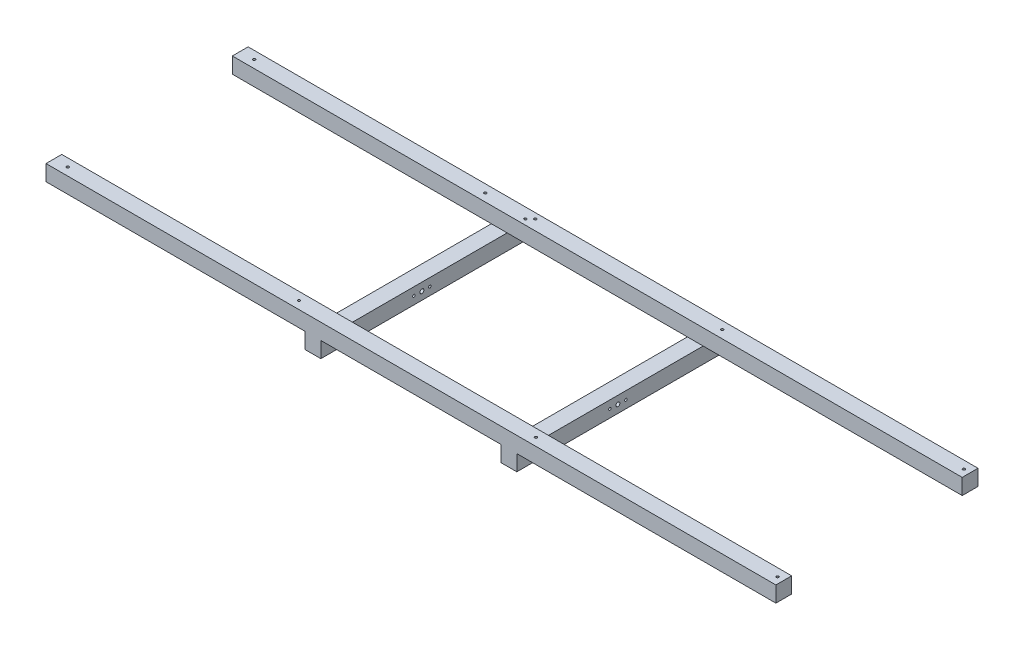
ISO-10303-21;
HEADER;
FILE_DESCRIPTION(('STEP AP214'),'2;1');
FILE_NAME('part.step','',(''),(''),'','','');
FILE_SCHEMA(('AUTOMOTIVE_DESIGN { 1 0 10303 214 1 1 1 1 }'));
ENDSEC;
DATA;
#1=APPLICATION_CONTEXT('core data for automotive mechanical design processes');
#2=APPLICATION_PROTOCOL_DEFINITION('international standard','automotive_design',2000,#1);
#3=PRODUCT_CONTEXT('',#1,'mechanical');
#4=PRODUCT('Part','Part','',(#3));
#5=PRODUCT_RELATED_PRODUCT_CATEGORY('part','',(#4));
#6=PRODUCT_DEFINITION_FORMATION('','',#4);
#7=PRODUCT_DEFINITION_CONTEXT('part definition',#1,'design');
#8=PRODUCT_DEFINITION('design','',#6,#7);
#9=PRODUCT_DEFINITION_SHAPE('','',#8);
#10=(LENGTH_UNIT() NAMED_UNIT(*) SI_UNIT(.MILLI.,.METRE.));
#11=(NAMED_UNIT(*) PLANE_ANGLE_UNIT() SI_UNIT($,.RADIAN.));
#12=(NAMED_UNIT(*) SI_UNIT($,.STERADIAN.) SOLID_ANGLE_UNIT());
#13=UNCERTAINTY_MEASURE_WITH_UNIT(LENGTH_MEASURE(1.E-05),#10,'distance_accuracy_value','');
#14=(GEOMETRIC_REPRESENTATION_CONTEXT(3) GLOBAL_UNCERTAINTY_ASSIGNED_CONTEXT((#13)) GLOBAL_UNIT_ASSIGNED_CONTEXT((#10,
#11,#12)) REPRESENTATION_CONTEXT('',''));
#15=CARTESIAN_POINT('',(0.,0.,0.));
#16=DIRECTION('',(0.,0.,1.));
#17=DIRECTION('',(1.,0.,0.));
#18=AXIS2_PLACEMENT_3D('',#15,#16,#17);
#19=CARTESIAN_POINT('',(0.,0.,0.));
#20=DIRECTION('',(0.,1.,0.));
#21=DIRECTION('',(0.,0.,1.));
#22=AXIS2_PLACEMENT_3D('',#19,#20,#21);
#23=PLANE('',#22);
#24=DIRECTION('',(0.,0.,1.));
#25=VECTOR('',#24,1.);
#26=CARTESIAN_POINT('',(-212.55,0.,-202.85));
#27=LINE('',#26,#25);
#28=CARTESIAN_POINT('',(-212.55,0.,-171.15));
#29=VERTEX_POINT('',#28);
#30=CARTESIAN_POINT('',(-212.55,0.,171.15));
#31=VERTEX_POINT('',#30);
#32=EDGE_CURVE('E275',#29,#31,#27,.T.);
#33=ORIENTED_EDGE('',*,*,#32,.T.);
#34=DIRECTION('',(-1.,0.,0.));
#35=VECTOR('',#34,1.);
#36=CARTESIAN_POINT('',(-732.55,0.,171.15));
#37=LINE('',#36,#35);
#38=CARTESIAN_POINT('',(-180.85,0.,171.15));
#39=VERTEX_POINT('',#38);
#40=EDGE_CURVE('E448',#39,#31,#37,.T.);
#41=ORIENTED_EDGE('',*,*,#40,.F.);
#42=DIRECTION('',(0.,0.,-1.));
#43=VECTOR('',#42,1.);
#44=CARTESIAN_POINT('',(-180.85,0.,-202.85));
#45=LINE('',#44,#43);
#46=CARTESIAN_POINT('',(-180.85,0.,-171.15));
#47=VERTEX_POINT('',#46);
#48=EDGE_CURVE('E295',#39,#47,#45,.T.);
#49=ORIENTED_EDGE('',*,*,#48,.T.);
#50=DIRECTION('',(1.,0.,0.));
#51=VECTOR('',#50,1.);
#52=CARTESIAN_POINT('',(-732.55,0.,-171.15));
#53=LINE('',#52,#51);
#54=EDGE_CURVE('E11',#29,#47,#53,.T.);
#55=ORIENTED_EDGE('',*,*,#54,.F.);
#56=EDGE_LOOP('',(#33,#41,#49,#55));
#57=FACE_BOUND('',#56,.T.);
#58=ADVANCED_FACE('F33',(#57),#23,.T.);
#59=CARTESIAN_POINT('',(0.,0.,0.));
#60=DIRECTION('',(0.,1.,0.));
#61=DIRECTION('',(0.,0.,1.));
#62=AXIS2_PLACEMENT_3D('',#59,#60,#61);
#63=PLANE('',#62);
#64=DIRECTION('',(0.,0.,1.));
#65=VECTOR('',#64,1.);
#66=CARTESIAN_POINT('',(180.85,0.,-202.85));
#67=LINE('',#66,#65);
#68=CARTESIAN_POINT('',(180.85,0.,-171.15));
#69=VERTEX_POINT('',#68);
#70=CARTESIAN_POINT('',(180.85,0.,171.15));
#71=VERTEX_POINT('',#70);
#72=EDGE_CURVE('E212',#69,#71,#67,.T.);
#73=ORIENTED_EDGE('',*,*,#72,.T.);
#74=CARTESIAN_POINT('',(212.55,0.,171.15));
#75=VERTEX_POINT('',#74);
#76=EDGE_CURVE('E412',#75,#71,#37,.T.);
#77=ORIENTED_EDGE('',*,*,#76,.F.);
#78=DIRECTION('',(0.,0.,-1.));
#79=VECTOR('',#78,1.);
#80=CARTESIAN_POINT('',(212.55,0.,-202.85));
#81=LINE('',#80,#79);
#82=CARTESIAN_POINT('',(212.55,0.,-171.15));
#83=VERTEX_POINT('',#82);
#84=EDGE_CURVE('E233',#75,#83,#81,.T.);
#85=ORIENTED_EDGE('',*,*,#84,.T.);
#86=EDGE_CURVE('E447',#69,#83,#53,.T.);
#87=ORIENTED_EDGE('',*,*,#86,.F.);
#88=EDGE_LOOP('',(#73,#77,#85,#87));
#89=FACE_BOUND('',#88,.T.);
#90=ADVANCED_FACE('F446',(#89),#63,.T.);
#91=CARTESIAN_POINT('',(0.,0.,0.));
#92=DIRECTION('',(0.,1.,0.));
#93=DIRECTION('',(0.,0.,1.));
#94=AXIS2_PLACEMENT_3D('',#91,#92,#93);
#95=PLANE('',#94);
#96=CARTESIAN_POINT('',(-155.,0.,-182.));
#97=DIRECTION('',(0.,1.,0.));
#98=DIRECTION('',(0.,0.,1.));
#99=AXIS2_PLACEMENT_3D('',#96,#97,#98);
#100=CIRCLE('',#99,2.5);
#101=CARTESIAN_POINT('',(-155.,0.,-179.5));
#102=VERTEX_POINT('',#101);
#103=EDGE_CURVE('E343',#102,#102,#100,.T.);
#104=ORIENTED_EDGE('',*,*,#103,.T.);
#105=EDGE_LOOP('',(#104));
#106=FACE_BOUND('',#105,.T.);
#107=CARTESIAN_POINT('',(-145.,0.,-192.));
#108=DIRECTION('',(0.,1.,0.));
#109=DIRECTION('',(0.,0.,1.));
#110=AXIS2_PLACEMENT_3D('',#107,#108,#109);
#111=CIRCLE('',#110,2.5);
#112=CARTESIAN_POINT('',(-145.,0.,-189.5));
#113=VERTEX_POINT('',#112);
#114=EDGE_CURVE('E339',#113,#113,#111,.T.);
#115=ORIENTED_EDGE('',*,*,#114,.T.);
#116=EDGE_LOOP('',(#115));
#117=FACE_BOUND('',#116,.T.);
#118=DIRECTION('',(-1.,0.,0.));
#119=VECTOR('',#118,1.);
#120=CARTESIAN_POINT('',(-732.55,0.,-202.85));
#121=LINE('',#120,#119);
#122=CARTESIAN_POINT('',(180.85,0.,-202.85));
#123=VERTEX_POINT('',#122);
#124=CARTESIAN_POINT('',(-180.85,0.,-202.85));
#125=VERTEX_POINT('',#124);
#126=EDGE_CURVE('E263',#123,#125,#121,.T.);
#127=ORIENTED_EDGE('',*,*,#126,.F.);
#128=EDGE_CURVE('E227',#123,#69,#67,.T.);
#129=ORIENTED_EDGE('',*,*,#128,.T.);
#130=EDGE_CURVE('E45',#47,#69,#53,.T.);
#131=ORIENTED_EDGE('',*,*,#130,.F.);
#132=EDGE_CURVE('E293',#47,#125,#45,.T.);
#133=ORIENTED_EDGE('',*,*,#132,.T.);
#134=EDGE_LOOP('',(#127,#129,#131,#133));
#135=FACE_BOUND('',#134,.T.);
#136=ADVANCED_FACE('F494',(#106,#117,#135),#95,.F.);
#137=CARTESIAN_POINT('',(-212.55,-31.7,-202.85));
#138=DIRECTION('',(-1.,0.,0.));
#139=DIRECTION('',(0.,0.,1.));
#140=AXIS2_PLACEMENT_3D('',#137,#138,#139);
#141=PLANE('',#140);
#142=CARTESIAN_POINT('',(-212.55,-15.85,-16.));
#143=DIRECTION('',(-1.,0.,0.));
#144=DIRECTION('',(0.,0.,1.));
#145=AXIS2_PLACEMENT_3D('',#142,#143,#144);
#146=CIRCLE('',#145,2.5);
#147=CARTESIAN_POINT('',(-212.55,-15.85,-13.5));
#148=VERTEX_POINT('',#147);
#149=EDGE_CURVE('E336',#148,#148,#146,.T.);
#150=ORIENTED_EDGE('',*,*,#149,.F.);
#151=EDGE_LOOP('',(#150));
#152=FACE_BOUND('',#151,.T.);
#153=CARTESIAN_POINT('',(-212.55,-15.85,16.));
#154=DIRECTION('',(-1.,0.,0.));
#155=DIRECTION('',(0.,0.,1.));
#156=AXIS2_PLACEMENT_3D('',#153,#154,#155);
#157=CIRCLE('',#156,2.5);
#158=CARTESIAN_POINT('',(-212.55,-15.85,18.5));
#159=VERTEX_POINT('',#158);
#160=EDGE_CURVE('E327',#159,#159,#157,.T.);
#161=ORIENTED_EDGE('',*,*,#160,.F.);
#162=EDGE_LOOP('',(#161));
#163=FACE_BOUND('',#162,.T.);
#164=CARTESIAN_POINT('',(-212.55,-15.85,0.));
#165=DIRECTION('',(-1.,0.,0.));
#166=DIRECTION('',(0.,0.,1.));
#167=AXIS2_PLACEMENT_3D('',#164,#165,#166);
#168=CIRCLE('',#167,4.);
#169=CARTESIAN_POINT('',(-212.55,-15.85,4.));
#170=VERTEX_POINT('',#169);
#171=EDGE_CURVE('E310',#170,#170,#168,.T.);
#172=ORIENTED_EDGE('',*,*,#171,.F.);
#173=EDGE_LOOP('',(#172));
#174=FACE_BOUND('',#173,.T.);
#175=CARTESIAN_POINT('',(-212.55,0.,-202.85));
#176=VERTEX_POINT('',#175);
#177=EDGE_CURVE('E290',#176,#29,#27,.T.);
#178=ORIENTED_EDGE('',*,*,#177,.F.);
#179=DIRECTION('',(0.,1.,0.));
#180=VECTOR('',#179,1.);
#181=CARTESIAN_POINT('',(-212.55,-31.7,-202.85));
#182=LINE('',#181,#180);
#183=CARTESIAN_POINT('',(-212.55,-31.7,-202.85));
#184=VERTEX_POINT('',#183);
#185=EDGE_CURVE('E42',#184,#176,#182,.T.);
#186=ORIENTED_EDGE('',*,*,#185,.F.);
#187=DIRECTION('',(0.,0.,1.));
#188=VECTOR('',#187,1.);
#189=CARTESIAN_POINT('',(-212.55,-31.7,-202.85));
#190=LINE('',#189,#188);
#191=CARTESIAN_POINT('',(-212.55,-31.7,202.85));
#192=VERTEX_POINT('',#191);
#193=EDGE_CURVE('E276',#184,#192,#190,.T.);
#194=ORIENTED_EDGE('',*,*,#193,.T.);
#195=DIRECTION('',(0.,1.,0.));
#196=VECTOR('',#195,1.);
#197=CARTESIAN_POINT('',(-212.55,-31.7,202.85));
#198=LINE('',#197,#196);
#199=CARTESIAN_POINT('',(-212.55,0.,202.85));
#200=VERTEX_POINT('',#199);
#201=EDGE_CURVE('E289',#192,#200,#198,.T.);
#202=ORIENTED_EDGE('',*,*,#201,.T.);
#203=DIRECTION('',(0.,0.,1.));
#204=VECTOR('',#203,1.);
#205=CARTESIAN_POINT('',(-212.55,0.,-202.85));
#206=LINE('',#205,#204);
#207=EDGE_CURVE('E205',#31,#200,#206,.T.);
#208=ORIENTED_EDGE('',*,*,#207,.F.);
#209=ORIENTED_EDGE('',*,*,#32,.F.);
#210=EDGE_LOOP('',(#178,#186,#194,#202,#208,#209));
#211=FACE_BOUND('',#210,.T.);
#212=ADVANCED_FACE('F35',(#152,#163,#174,#211),#141,.T.);
#213=CARTESIAN_POINT('',(-212.55,-31.7,-202.85));
#214=DIRECTION('',(0.,0.,-1.));
#215=DIRECTION('',(-1.,0.,0.));
#216=AXIS2_PLACEMENT_3D('',#213,#214,#215);
#217=PLANE('',#216);
#218=ORIENTED_EDGE('',*,*,#185,.T.);
#219=CARTESIAN_POINT('',(-732.55,0.,-202.85));
#220=VERTEX_POINT('',#219);
#221=EDGE_CURVE('E260',#176,#220,#121,.T.);
#222=ORIENTED_EDGE('',*,*,#221,.T.);
#223=DIRECTION('',(0.,-1.,0.));
#224=VECTOR('',#223,1.);
#225=CARTESIAN_POINT('',(-732.55,31.7,-202.85));
#226=LINE('',#225,#224);
#227=CARTESIAN_POINT('',(-732.55,31.7,-202.85));
#228=VERTEX_POINT('',#227);
#229=EDGE_CURVE('E253',#228,#220,#226,.T.);
#230=ORIENTED_EDGE('',*,*,#229,.F.);
#231=DIRECTION('',(-1.,0.,0.));
#232=VECTOR('',#231,1.);
#233=CARTESIAN_POINT('',(-732.55,31.7,-202.85));
#234=LINE('',#233,#232);
#235=CARTESIAN_POINT('',(732.55,31.7,-202.85));
#236=VERTEX_POINT('',#235);
#237=EDGE_CURVE('E251',#236,#228,#234,.T.);
#238=ORIENTED_EDGE('',*,*,#237,.F.);
#239=DIRECTION('',(0.,-1.,0.));
#240=VECTOR('',#239,1.);
#241=CARTESIAN_POINT('',(732.55,31.7,-202.85));
#242=LINE('',#241,#240);
#243=CARTESIAN_POINT('',(732.55,0.,-202.85));
#244=VERTEX_POINT('',#243);
#245=EDGE_CURVE('E266',#236,#244,#242,.T.);
#246=ORIENTED_EDGE('',*,*,#245,.T.);
#247=CARTESIAN_POINT('',(212.55,0.,-202.85));
#248=VERTEX_POINT('',#247);
#249=EDGE_CURVE('E247',#244,#248,#121,.T.);
#250=ORIENTED_EDGE('',*,*,#249,.T.);
#251=DIRECTION('',(0.,1.,0.));
#252=VECTOR('',#251,1.);
#253=CARTESIAN_POINT('',(212.55,-31.7,-202.85));
#254=LINE('',#253,#252);
#255=CARTESIAN_POINT('',(212.55,-31.7,-202.85));
#256=VERTEX_POINT('',#255);
#257=EDGE_CURVE('E237',#256,#248,#254,.T.);
#258=ORIENTED_EDGE('',*,*,#257,.F.);
#259=DIRECTION('',(-1.,0.,0.));
#260=VECTOR('',#259,1.);
#261=CARTESIAN_POINT('',(180.85,-31.7,-202.85));
#262=LINE('',#261,#260);
#263=CARTESIAN_POINT('',(180.85,-31.7,-202.85));
#264=VERTEX_POINT('',#263);
#265=EDGE_CURVE('E223',#256,#264,#262,.T.);
#266=ORIENTED_EDGE('',*,*,#265,.T.);
#267=DIRECTION('',(0.,1.,0.));
#268=VECTOR('',#267,1.);
#269=CARTESIAN_POINT('',(180.85,-31.7,-202.85));
#270=LINE('',#269,#268);
#271=EDGE_CURVE('E234',#264,#123,#270,.T.);
#272=ORIENTED_EDGE('',*,*,#271,.T.);
#273=ORIENTED_EDGE('',*,*,#126,.T.);
#274=DIRECTION('',(0.,1.,0.));
#275=VECTOR('',#274,1.);
#276=CARTESIAN_POINT('',(-180.85,-31.7,-202.85));
#277=LINE('',#276,#275);
#278=CARTESIAN_POINT('',(-180.85,-31.7,-202.85));
#279=VERTEX_POINT('',#278);
#280=EDGE_CURVE('E297',#279,#125,#277,.T.);
#281=ORIENTED_EDGE('',*,*,#280,.F.);
#282=DIRECTION('',(-1.,0.,0.));
#283=VECTOR('',#282,1.);
#284=CARTESIAN_POINT('',(-212.55,-31.7,-202.85));
#285=LINE('',#284,#283);
#286=EDGE_CURVE('E286',#279,#184,#285,.T.);
#287=ORIENTED_EDGE('',*,*,#286,.T.);
#288=EDGE_LOOP('',(#218,#222,#230,#238,#246,#250,#258,#266,#272,#273,#281,#287));
#289=FACE_BOUND('',#288,.T.);
#290=ADVANCED_FACE('F437',(#289),#217,.T.);
#291=CARTESIAN_POINT('',(-180.85,-31.7,-202.85));
#292=DIRECTION('',(1.,0.,0.));
#293=DIRECTION('',(0.,0.,-1.));
#294=AXIS2_PLACEMENT_3D('',#291,#292,#293);
#295=PLANE('',#294);
#296=CARTESIAN_POINT('',(-180.85,-15.85,-16.));
#297=DIRECTION('',(1.,0.,0.));
#298=DIRECTION('',(0.,0.,-1.));
#299=AXIS2_PLACEMENT_3D('',#296,#297,#298);
#300=CIRCLE('',#299,2.5);
#301=CARTESIAN_POINT('',(-180.85,-15.85,-18.5));
#302=VERTEX_POINT('',#301);
#303=EDGE_CURVE('E333',#302,#302,#300,.T.);
#304=ORIENTED_EDGE('',*,*,#303,.F.);
#305=EDGE_LOOP('',(#304));
#306=FACE_BOUND('',#305,.T.);
#307=CARTESIAN_POINT('',(-180.85,-15.85,16.));
#308=DIRECTION('',(1.,0.,0.));
#309=DIRECTION('',(0.,0.,-1.));
#310=AXIS2_PLACEMENT_3D('',#307,#308,#309);
#311=CIRCLE('',#310,2.5);
#312=CARTESIAN_POINT('',(-180.85,-15.85,13.5));
#313=VERTEX_POINT('',#312);
#314=EDGE_CURVE('E314',#313,#313,#311,.T.);
#315=ORIENTED_EDGE('',*,*,#314,.F.);
#316=EDGE_LOOP('',(#315));
#317=FACE_BOUND('',#316,.T.);
#318=CARTESIAN_POINT('',(-180.85,-15.85,0.));
#319=DIRECTION('',(1.,0.,0.));
#320=DIRECTION('',(0.,0.,-1.));
#321=AXIS2_PLACEMENT_3D('',#318,#319,#320);
#322=CIRCLE('',#321,4.);
#323=CARTESIAN_POINT('',(-180.85,-15.85,-4.));
#324=VERTEX_POINT('',#323);
#325=EDGE_CURVE('E317',#324,#324,#322,.T.);
#326=ORIENTED_EDGE('',*,*,#325,.F.);
#327=EDGE_LOOP('',(#326));
#328=FACE_BOUND('',#327,.T.);
#329=CARTESIAN_POINT('',(-180.85,0.,202.85));
#330=VERTEX_POINT('',#329);
#331=EDGE_CURVE('E280',#330,#39,#45,.T.);
#332=ORIENTED_EDGE('',*,*,#331,.F.);
#333=DIRECTION('',(0.,1.,0.));
#334=VECTOR('',#333,1.);
#335=CARTESIAN_POINT('',(-180.85,-31.7,202.85));
#336=LINE('',#335,#334);
#337=CARTESIAN_POINT('',(-180.85,-31.7,202.85));
#338=VERTEX_POINT('',#337);
#339=EDGE_CURVE('E300',#338,#330,#336,.T.);
#340=ORIENTED_EDGE('',*,*,#339,.F.);
#341=DIRECTION('',(0.,0.,-1.));
#342=VECTOR('',#341,1.);
#343=CARTESIAN_POINT('',(-180.85,-31.7,-202.85));
#344=LINE('',#343,#342);
#345=EDGE_CURVE('E283',#338,#279,#344,.T.);
#346=ORIENTED_EDGE('',*,*,#345,.T.);
#347=ORIENTED_EDGE('',*,*,#280,.T.);
#348=ORIENTED_EDGE('',*,*,#132,.F.);
#349=ORIENTED_EDGE('',*,*,#48,.F.);
#350=EDGE_LOOP('',(#332,#340,#346,#347,#348,#349));
#351=FACE_BOUND('',#350,.T.);
#352=ADVANCED_FACE('F467',(#306,#317,#328,#351),#295,.T.);
#353=CARTESIAN_POINT('',(-212.55,-31.7,202.85));
#354=DIRECTION('',(0.,0.,1.));
#355=DIRECTION('',(1.,0.,0.));
#356=AXIS2_PLACEMENT_3D('',#353,#354,#355);
#357=PLANE('',#356);
#358=ORIENTED_EDGE('',*,*,#339,.T.);
#359=DIRECTION('',(1.,0.,0.));
#360=VECTOR('',#359,1.);
#361=CARTESIAN_POINT('',(-732.55,0.,202.85));
#362=LINE('',#361,#360);
#363=CARTESIAN_POINT('',(180.85,0.,202.85));
#364=VERTEX_POINT('',#363);
#365=EDGE_CURVE('E407',#330,#364,#362,.T.);
#366=ORIENTED_EDGE('',*,*,#365,.T.);
#367=DIRECTION('',(0.,1.,0.));
#368=VECTOR('',#367,1.);
#369=CARTESIAN_POINT('',(180.85,-31.7,202.85));
#370=LINE('',#369,#368);
#371=CARTESIAN_POINT('',(180.85,-31.7,202.85));
#372=VERTEX_POINT('',#371);
#373=EDGE_CURVE('E226',#372,#364,#370,.T.);
#374=ORIENTED_EDGE('',*,*,#373,.F.);
#375=DIRECTION('',(1.,0.,0.));
#376=VECTOR('',#375,1.);
#377=CARTESIAN_POINT('',(180.85,-31.7,202.85));
#378=LINE('',#377,#376);
#379=CARTESIAN_POINT('',(212.55,-31.7,202.85));
#380=VERTEX_POINT('',#379);
#381=EDGE_CURVE('E216',#372,#380,#378,.T.);
#382=ORIENTED_EDGE('',*,*,#381,.T.);
#383=DIRECTION('',(0.,1.,0.));
#384=VECTOR('',#383,1.);
#385=CARTESIAN_POINT('',(212.55,-31.7,202.85));
#386=LINE('',#385,#384);
#387=CARTESIAN_POINT('',(212.55,0.,202.85));
#388=VERTEX_POINT('',#387);
#389=EDGE_CURVE('E239',#380,#388,#386,.T.);
#390=ORIENTED_EDGE('',*,*,#389,.T.);
#391=CARTESIAN_POINT('',(732.55,0.,202.85));
#392=VERTEX_POINT('',#391);
#393=EDGE_CURVE('E403',#388,#392,#362,.T.);
#394=ORIENTED_EDGE('',*,*,#393,.T.);
#395=DIRECTION('',(0.,-1.,0.));
#396=VECTOR('',#395,1.);
#397=CARTESIAN_POINT('',(732.55,31.7,202.85));
#398=LINE('',#397,#396);
#399=CARTESIAN_POINT('',(732.55,31.7,202.85));
#400=VERTEX_POINT('',#399);
#401=EDGE_CURVE('E186',#400,#392,#398,.T.);
#402=ORIENTED_EDGE('',*,*,#401,.F.);
#403=DIRECTION('',(1.,0.,0.));
#404=VECTOR('',#403,1.);
#405=CARTESIAN_POINT('',(-732.55,31.7,202.85));
#406=LINE('',#405,#404);
#407=CARTESIAN_POINT('',(-732.55,31.7,202.85));
#408=VERTEX_POINT('',#407);
#409=EDGE_CURVE('E177',#408,#400,#406,.T.);
#410=ORIENTED_EDGE('',*,*,#409,.F.);
#411=DIRECTION('',(0.,-1.,0.));
#412=VECTOR('',#411,1.);
#413=CARTESIAN_POINT('',(-732.55,31.7,202.85));
#414=LINE('',#413,#412);
#415=CARTESIAN_POINT('',(-732.55,0.,202.85));
#416=VERTEX_POINT('',#415);
#417=EDGE_CURVE('E183',#408,#416,#414,.T.);
#418=ORIENTED_EDGE('',*,*,#417,.T.);
#419=EDGE_CURVE('E404',#416,#200,#362,.T.);
#420=ORIENTED_EDGE('',*,*,#419,.T.);
#421=ORIENTED_EDGE('',*,*,#201,.F.);
#422=DIRECTION('',(1.,0.,0.));
#423=VECTOR('',#422,1.);
#424=CARTESIAN_POINT('',(-212.55,-31.7,202.85));
#425=LINE('',#424,#423);
#426=EDGE_CURVE('E279',#192,#338,#425,.T.);
#427=ORIENTED_EDGE('',*,*,#426,.T.);
#428=EDGE_LOOP('',(#358,#366,#374,#382,#390,#394,#402,#410,#418,#420,#421,#427));
#429=FACE_BOUND('',#428,.T.);
#430=ADVANCED_FACE('F180',(#429),#357,.T.);
#431=CARTESIAN_POINT('',(0.,-31.7,0.));
#432=DIRECTION('',(0.,1.,0.));
#433=DIRECTION('',(0.,0.,1.));
#434=AXIS2_PLACEMENT_3D('',#431,#432,#433);
#435=PLANE('',#434);
#436=ORIENTED_EDGE('',*,*,#193,.F.);
#437=ORIENTED_EDGE('',*,*,#286,.F.);
#438=ORIENTED_EDGE('',*,*,#345,.F.);
#439=ORIENTED_EDGE('',*,*,#426,.F.);
#440=EDGE_LOOP('',(#436,#437,#438,#439));
#441=FACE_BOUND('',#440,.T.);
#442=ADVANCED_FACE('F461',(#441),#435,.F.);
#443=CARTESIAN_POINT('',(-240.55,0.,-187.));
#444=DIRECTION('',(0.,1.,0.));
#445=DIRECTION('',(0.,0.,1.));
#446=AXIS2_PLACEMENT_3D('',#443,#444,#445);
#447=CIRCLE('',#446,2.5);
#448=CARTESIAN_POINT('',(-240.55,0.,-184.5));
#449=VERTEX_POINT('',#448);
#450=EDGE_CURVE('E349',#449,#449,#447,.T.);
#451=ORIENTED_EDGE('',*,*,#450,.T.);
#452=EDGE_LOOP('',(#451));
#453=FACE_BOUND('',#452,.T.);
#454=CARTESIAN_POINT('',(-704.55,0.,-187.));
#455=DIRECTION('',(0.,1.,0.));
#456=DIRECTION('',(0.,0.,1.));
#457=AXIS2_PLACEMENT_3D('',#454,#455,#456);
#458=CIRCLE('',#457,2.49999999999991);
#459=CARTESIAN_POINT('',(-704.55,0.,-184.5));
#460=VERTEX_POINT('',#459);
#461=EDGE_CURVE('E361',#460,#460,#458,.T.);
#462=ORIENTED_EDGE('',*,*,#461,.T.);
#463=EDGE_LOOP('',(#462));
#464=FACE_BOUND('',#463,.T.);
#465=ORIENTED_EDGE('',*,*,#221,.F.);
#466=ORIENTED_EDGE('',*,*,#177,.T.);
#467=CARTESIAN_POINT('',(-732.55,0.,-171.15));
#468=VERTEX_POINT('',#467);
#469=EDGE_CURVE('E44',#468,#29,#53,.T.);
#470=ORIENTED_EDGE('',*,*,#469,.F.);
#471=DIRECTION('',(0.,0.,1.));
#472=VECTOR('',#471,1.);
#473=CARTESIAN_POINT('',(-732.55,0.,-202.85));
#474=LINE('',#473,#472);
#475=EDGE_CURVE('E236',#220,#468,#474,.T.);
#476=ORIENTED_EDGE('',*,*,#475,.F.);
#477=EDGE_LOOP('',(#465,#466,#470,#476));
#478=FACE_BOUND('',#477,.T.);
#479=ADVANCED_FACE('F474',(#453,#464,#478),#95,.F.);
#480=CARTESIAN_POINT('',(235.05,0.,-187.));
#481=DIRECTION('',(0.,1.,0.));
#482=DIRECTION('',(0.,0.,1.));
#483=AXIS2_PLACEMENT_3D('',#480,#481,#482);
#484=CIRCLE('',#483,2.5);
#485=CARTESIAN_POINT('',(235.05,0.,-184.5));
#486=VERTEX_POINT('',#485);
#487=EDGE_CURVE('E373',#486,#486,#484,.T.);
#488=ORIENTED_EDGE('',*,*,#487,.T.);
#489=EDGE_LOOP('',(#488));
#490=FACE_BOUND('',#489,.T.);
#491=CARTESIAN_POINT('',(720.,0.,-187.));
#492=DIRECTION('',(0.,1.,0.));
#493=DIRECTION('',(0.,0.,1.));
#494=AXIS2_PLACEMENT_3D('',#491,#492,#493);
#495=CIRCLE('',#494,2.49999999999991);
#496=CARTESIAN_POINT('',(720.,0.,-184.5));
#497=VERTEX_POINT('',#496);
#498=EDGE_CURVE('E385',#497,#497,#495,.T.);
#499=ORIENTED_EDGE('',*,*,#498,.T.);
#500=EDGE_LOOP('',(#499));
#501=FACE_BOUND('',#500,.T.);
#502=CARTESIAN_POINT('',(732.55,0.,-171.15));
#503=VERTEX_POINT('',#502);
#504=EDGE_CURVE('E255',#83,#503,#53,.T.);
#505=ORIENTED_EDGE('',*,*,#504,.F.);
#506=EDGE_CURVE('E230',#83,#248,#81,.T.);
#507=ORIENTED_EDGE('',*,*,#506,.T.);
#508=ORIENTED_EDGE('',*,*,#249,.F.);
#509=DIRECTION('',(0.,0.,-1.));
#510=VECTOR('',#509,1.);
#511=CARTESIAN_POINT('',(732.55,0.,-202.85));
#512=LINE('',#511,#510);
#513=EDGE_CURVE('E258',#503,#244,#512,.T.);
#514=ORIENTED_EDGE('',*,*,#513,.F.);
#515=EDGE_LOOP('',(#505,#507,#508,#514));
#516=FACE_BOUND('',#515,.T.);
#517=ADVANCED_FACE('F442',(#490,#501,#516),#95,.F.);
#518=CARTESIAN_POINT('',(-732.55,31.7,-202.85));
#519=DIRECTION('',(1.,0.,0.));
#520=DIRECTION('',(0.,0.,-1.));
#521=AXIS2_PLACEMENT_3D('',#518,#519,#520);
#522=PLANE('',#521);
#523=ORIENTED_EDGE('',*,*,#475,.T.);
#524=DIRECTION('',(0.,-1.,0.));
#525=VECTOR('',#524,1.);
#526=CARTESIAN_POINT('',(-732.55,31.7,-171.15));
#527=LINE('',#526,#525);
#528=CARTESIAN_POINT('',(-732.55,31.7,-171.15));
#529=VERTEX_POINT('',#528);
#530=EDGE_CURVE('E272',#529,#468,#527,.T.);
#531=ORIENTED_EDGE('',*,*,#530,.F.);
#532=DIRECTION('',(0.,0.,1.));
#533=VECTOR('',#532,1.);
#534=CARTESIAN_POINT('',(-732.55,31.7,-202.85));
#535=LINE('',#534,#533);
#536=EDGE_CURVE('E243',#228,#529,#535,.T.);
#537=ORIENTED_EDGE('',*,*,#536,.F.);
#538=ORIENTED_EDGE('',*,*,#229,.T.);
#539=EDGE_LOOP('',(#523,#531,#537,#538));
#540=FACE_BOUND('',#539,.T.);
#541=ADVANCED_FACE('F483',(#540),#522,.F.);
#542=CARTESIAN_POINT('',(-732.55,31.7,-171.15));
#543=DIRECTION('',(0.,0.,-1.));
#544=DIRECTION('',(-1.,0.,0.));
#545=AXIS2_PLACEMENT_3D('',#542,#543,#544);
#546=PLANE('',#545);
#547=ORIENTED_EDGE('',*,*,#469,.T.);
#548=ORIENTED_EDGE('',*,*,#54,.T.);
#549=ORIENTED_EDGE('',*,*,#130,.T.);
#550=ORIENTED_EDGE('',*,*,#86,.T.);
#551=ORIENTED_EDGE('',*,*,#504,.T.);
#552=DIRECTION('',(0.,-1.,0.));
#553=VECTOR('',#552,1.);
#554=CARTESIAN_POINT('',(732.55,31.7,-171.15));
#555=LINE('',#554,#553);
#556=CARTESIAN_POINT('',(732.55,31.7,-171.15));
#557=VERTEX_POINT('',#556);
#558=EDGE_CURVE('E269',#557,#503,#555,.T.);
#559=ORIENTED_EDGE('',*,*,#558,.F.);
#560=DIRECTION('',(1.,0.,0.));
#561=VECTOR('',#560,1.);
#562=CARTESIAN_POINT('',(-732.55,31.7,-171.15));
#563=LINE('',#562,#561);
#564=EDGE_CURVE('E246',#529,#557,#563,.T.);
#565=ORIENTED_EDGE('',*,*,#564,.F.);
#566=ORIENTED_EDGE('',*,*,#530,.T.);
#567=EDGE_LOOP('',(#547,#548,#549,#550,#551,#559,#565,#566));
#568=FACE_BOUND('',#567,.T.);
#569=ADVANCED_FACE('F477',(#568),#546,.F.);
#570=CARTESIAN_POINT('',(732.55,31.7,-202.85));
#571=DIRECTION('',(-1.,0.,0.));
#572=DIRECTION('',(0.,0.,1.));
#573=AXIS2_PLACEMENT_3D('',#570,#571,#572);
#574=PLANE('',#573);
#575=ORIENTED_EDGE('',*,*,#513,.T.);
#576=ORIENTED_EDGE('',*,*,#245,.F.);
#577=DIRECTION('',(0.,0.,-1.));
#578=VECTOR('',#577,1.);
#579=CARTESIAN_POINT('',(732.55,31.7,-202.85));
#580=LINE('',#579,#578);
#581=EDGE_CURVE('E249',#557,#236,#580,.T.);
#582=ORIENTED_EDGE('',*,*,#581,.F.);
#583=ORIENTED_EDGE('',*,*,#558,.T.);
#584=EDGE_LOOP('',(#575,#576,#582,#583));
#585=FACE_BOUND('',#584,.T.);
#586=ADVANCED_FACE('F491',(#585),#574,.F.);
#587=CARTESIAN_POINT('',(0.,31.7,0.));
#588=DIRECTION('',(0.,1.,0.));
#589=DIRECTION('',(0.,0.,1.));
#590=AXIS2_PLACEMENT_3D('',#587,#588,#589);
#591=PLANE('',#590);
#592=CARTESIAN_POINT('',(-240.55,31.7,-187.));
#593=DIRECTION('',(0.,1.,0.));
#594=DIRECTION('',(0.,0.,1.));
#595=AXIS2_PLACEMENT_3D('',#592,#593,#594);
#596=CIRCLE('',#595,2.5);
#597=CARTESIAN_POINT('',(-240.55,31.7,-184.5));
#598=VERTEX_POINT('',#597);
#599=EDGE_CURVE('E365',#598,#598,#596,.T.);
#600=ORIENTED_EDGE('',*,*,#599,.F.);
#601=EDGE_LOOP('',(#600));
#602=FACE_BOUND('',#601,.T.);
#603=CARTESIAN_POINT('',(-155.,31.7,-182.));
#604=DIRECTION('',(0.,1.,0.));
#605=DIRECTION('',(0.,0.,1.));
#606=AXIS2_PLACEMENT_3D('',#603,#604,#605);
#607=CIRCLE('',#606,2.5);
#608=CARTESIAN_POINT('',(-155.,31.7,-179.5));
#609=VERTEX_POINT('',#608);
#610=EDGE_CURVE('E353',#609,#609,#607,.T.);
#611=ORIENTED_EDGE('',*,*,#610,.F.);
#612=EDGE_LOOP('',(#611));
#613=FACE_BOUND('',#612,.T.);
#614=CARTESIAN_POINT('',(235.05,31.7,-187.));
#615=DIRECTION('',(0.,1.,0.));
#616=DIRECTION('',(0.,0.,1.));
#617=AXIS2_PLACEMENT_3D('',#614,#615,#616);
#618=CIRCLE('',#617,2.5);
#619=CARTESIAN_POINT('',(235.05,31.7,-184.5));
#620=VERTEX_POINT('',#619);
#621=EDGE_CURVE('E389',#620,#620,#618,.T.);
#622=ORIENTED_EDGE('',*,*,#621,.F.);
#623=EDGE_LOOP('',(#622));
#624=FACE_BOUND('',#623,.T.);
#625=CARTESIAN_POINT('',(-704.55,31.7,-187.));
#626=DIRECTION('',(0.,1.,0.));
#627=DIRECTION('',(0.,0.,1.));
#628=AXIS2_PLACEMENT_3D('',#625,#626,#627);
#629=CIRCLE('',#628,2.49999999999991);
#630=CARTESIAN_POINT('',(-704.55,31.7,-184.5));
#631=VERTEX_POINT('',#630);
#632=EDGE_CURVE('E377',#631,#631,#629,.T.);
#633=ORIENTED_EDGE('',*,*,#632,.F.);
#634=EDGE_LOOP('',(#633));
#635=FACE_BOUND('',#634,.T.);
#636=CARTESIAN_POINT('',(-145.,31.7,-192.));
#637=DIRECTION('',(0.,1.,0.));
#638=DIRECTION('',(0.,0.,1.));
#639=AXIS2_PLACEMENT_3D('',#636,#637,#638);
#640=CIRCLE('',#639,2.5);
#641=CARTESIAN_POINT('',(-145.,31.7,-189.5));
#642=VERTEX_POINT('',#641);
#643=EDGE_CURVE('E340',#642,#642,#640,.T.);
#644=ORIENTED_EDGE('',*,*,#643,.F.);
#645=EDGE_LOOP('',(#644));
#646=FACE_BOUND('',#645,.T.);
#647=CARTESIAN_POINT('',(720.,31.7,-187.));
#648=DIRECTION('',(0.,1.,0.));
#649=DIRECTION('',(0.,0.,1.));
#650=AXIS2_PLACEMENT_3D('',#647,#648,#649);
#651=CIRCLE('',#650,2.49999999999991);
#652=CARTESIAN_POINT('',(720.,31.7,-184.5));
#653=VERTEX_POINT('',#652);
#654=EDGE_CURVE('E394',#653,#653,#651,.T.);
#655=ORIENTED_EDGE('',*,*,#654,.F.);
#656=EDGE_LOOP('',(#655));
#657=FACE_BOUND('',#656,.T.);
#658=ORIENTED_EDGE('',*,*,#536,.T.);
#659=ORIENTED_EDGE('',*,*,#564,.T.);
#660=ORIENTED_EDGE('',*,*,#581,.T.);
#661=ORIENTED_EDGE('',*,*,#237,.T.);
#662=EDGE_LOOP('',(#658,#659,#660,#661));
#663=FACE_BOUND('',#662,.T.);
#664=ADVANCED_FACE('F488',(#602,#613,#624,#635,#646,#657,#663),#591,.T.);
#665=CARTESIAN_POINT('',(180.85,-31.7,-202.85));
#666=DIRECTION('',(-1.,0.,0.));
#667=DIRECTION('',(0.,0.,1.));
#668=AXIS2_PLACEMENT_3D('',#665,#666,#667);
#669=PLANE('',#668);
#670=CARTESIAN_POINT('',(180.85,-15.85,-16.));
#671=DIRECTION('',(-1.,0.,0.));
#672=DIRECTION('',(0.,0.,1.));
#673=AXIS2_PLACEMENT_3D('',#670,#671,#672);
#674=CIRCLE('',#673,2.5);
#675=CARTESIAN_POINT('',(180.85,-15.85,-13.5));
#676=VERTEX_POINT('',#675);
#677=EDGE_CURVE('E330',#676,#676,#674,.T.);
#678=ORIENTED_EDGE('',*,*,#677,.F.);
#679=EDGE_LOOP('',(#678));
#680=FACE_BOUND('',#679,.T.);
#681=CARTESIAN_POINT('',(180.85,-15.85,16.));
#682=DIRECTION('',(-1.,0.,0.));
#683=DIRECTION('',(0.,0.,1.));
#684=AXIS2_PLACEMENT_3D('',#681,#682,#683);
#685=CIRCLE('',#684,2.5);
#686=CARTESIAN_POINT('',(180.85,-15.85,18.5));
#687=VERTEX_POINT('',#686);
#688=EDGE_CURVE('E309',#687,#687,#685,.T.);
#689=ORIENTED_EDGE('',*,*,#688,.F.);
#690=EDGE_LOOP('',(#689));
#691=FACE_BOUND('',#690,.T.);
#692=CARTESIAN_POINT('',(180.85,-15.85,0.));
#693=DIRECTION('',(-1.,0.,0.));
#694=DIRECTION('',(0.,0.,1.));
#695=AXIS2_PLACEMENT_3D('',#692,#693,#694);
#696=CIRCLE('',#695,4.);
#697=CARTESIAN_POINT('',(180.85,-15.85,4.));
#698=VERTEX_POINT('',#697);
#699=EDGE_CURVE('E306',#698,#698,#696,.T.);
#700=ORIENTED_EDGE('',*,*,#699,.F.);
#701=EDGE_LOOP('',(#700));
#702=FACE_BOUND('',#701,.T.);
#703=ORIENTED_EDGE('',*,*,#128,.F.);
#704=ORIENTED_EDGE('',*,*,#271,.F.);
#705=DIRECTION('',(0.,0.,1.));
#706=VECTOR('',#705,1.);
#707=CARTESIAN_POINT('',(180.85,-31.7,-202.85));
#708=LINE('',#707,#706);
#709=EDGE_CURVE('E213',#264,#372,#708,.T.);
#710=ORIENTED_EDGE('',*,*,#709,.T.);
#711=ORIENTED_EDGE('',*,*,#373,.T.);
#712=DIRECTION('',(0.,0.,1.));
#713=VECTOR('',#712,1.);
#714=CARTESIAN_POINT('',(180.85,0.,-202.85));
#715=LINE('',#714,#713);
#716=EDGE_CURVE('E60',#71,#364,#715,.T.);
#717=ORIENTED_EDGE('',*,*,#716,.F.);
#718=ORIENTED_EDGE('',*,*,#72,.F.);
#719=EDGE_LOOP('',(#703,#704,#710,#711,#717,#718));
#720=FACE_BOUND('',#719,.T.);
#721=ADVANCED_FACE('F434',(#680,#691,#702,#720),#669,.T.);
#722=CARTESIAN_POINT('',(212.55,-31.7,-202.85));
#723=DIRECTION('',(1.,0.,0.));
#724=DIRECTION('',(0.,0.,-1.));
#725=AXIS2_PLACEMENT_3D('',#722,#723,#724);
#726=PLANE('',#725);
#727=CARTESIAN_POINT('',(212.55,-15.85,-16.));
#728=DIRECTION('',(1.,0.,0.));
#729=DIRECTION('',(0.,0.,-1.));
#730=AXIS2_PLACEMENT_3D('',#727,#728,#729);
#731=CIRCLE('',#730,2.5);
#732=CARTESIAN_POINT('',(212.55,-15.85,-18.5));
#733=VERTEX_POINT('',#732);
#734=EDGE_CURVE('E37',#733,#733,#731,.T.);
#735=ORIENTED_EDGE('',*,*,#734,.F.);
#736=EDGE_LOOP('',(#735));
#737=FACE_BOUND('',#736,.T.);
#738=CARTESIAN_POINT('',(212.55,-15.85,16.));
#739=DIRECTION('',(1.,0.,0.));
#740=DIRECTION('',(0.,0.,-1.));
#741=AXIS2_PLACEMENT_3D('',#738,#739,#740);
#742=CIRCLE('',#741,2.5);
#743=CARTESIAN_POINT('',(212.55,-15.85,13.5));
#744=VERTEX_POINT('',#743);
#745=EDGE_CURVE('E307',#744,#744,#742,.T.);
#746=ORIENTED_EDGE('',*,*,#745,.F.);
#747=EDGE_LOOP('',(#746));
#748=FACE_BOUND('',#747,.T.);
#749=CARTESIAN_POINT('',(212.55,-15.85,0.));
#750=DIRECTION('',(1.,0.,0.));
#751=DIRECTION('',(0.,0.,-1.));
#752=AXIS2_PLACEMENT_3D('',#749,#750,#751);
#753=CIRCLE('',#752,4.);
#754=CARTESIAN_POINT('',(212.55,-15.85,-4.));
#755=VERTEX_POINT('',#754);
#756=EDGE_CURVE('E304',#755,#755,#753,.T.);
#757=ORIENTED_EDGE('',*,*,#756,.F.);
#758=EDGE_LOOP('',(#757));
#759=FACE_BOUND('',#758,.T.);
#760=EDGE_CURVE('E217',#388,#75,#81,.T.);
#761=ORIENTED_EDGE('',*,*,#760,.F.);
#762=ORIENTED_EDGE('',*,*,#389,.F.);
#763=DIRECTION('',(0.,0.,-1.));
#764=VECTOR('',#763,1.);
#765=CARTESIAN_POINT('',(212.55,-31.7,-202.85));
#766=LINE('',#765,#764);
#767=EDGE_CURVE('E220',#380,#256,#766,.T.);
#768=ORIENTED_EDGE('',*,*,#767,.T.);
#769=ORIENTED_EDGE('',*,*,#257,.T.);
#770=ORIENTED_EDGE('',*,*,#506,.F.);
#771=ORIENTED_EDGE('',*,*,#84,.F.);
#772=EDGE_LOOP('',(#761,#762,#768,#769,#770,#771));
#773=FACE_BOUND('',#772,.T.);
#774=ADVANCED_FACE('F424',(#737,#748,#759,#773),#726,.T.);
#775=CARTESIAN_POINT('',(0.,-31.7,0.));
#776=DIRECTION('',(0.,1.,0.));
#777=DIRECTION('',(0.,0.,1.));
#778=AXIS2_PLACEMENT_3D('',#775,#776,#777);
#779=PLANE('',#778);
#780=ORIENTED_EDGE('',*,*,#709,.F.);
#781=ORIENTED_EDGE('',*,*,#265,.F.);
#782=ORIENTED_EDGE('',*,*,#767,.F.);
#783=ORIENTED_EDGE('',*,*,#381,.F.);
#784=EDGE_LOOP('',(#780,#781,#782,#783));
#785=FACE_BOUND('',#784,.T.);
#786=ADVANCED_FACE('F431',(#785),#779,.F.);
#787=CARTESIAN_POINT('',(0.,0.,0.));
#788=DIRECTION('',(0.,-1.,0.));
#789=DIRECTION('',(0.,0.,-1.));
#790=AXIS2_PLACEMENT_3D('',#787,#788,#789);
#791=PLANE('',#790);
#792=CARTESIAN_POINT('',(-704.55,0.,187.));
#793=DIRECTION('',(0.,1.,0.));
#794=DIRECTION('',(0.,0.,1.));
#795=AXIS2_PLACEMENT_3D('',#792,#793,#794);
#796=CIRCLE('',#795,2.49999999999991);
#797=CARTESIAN_POINT('',(-704.55,0.,189.5));
#798=VERTEX_POINT('',#797);
#799=EDGE_CURVE('E362',#798,#798,#796,.T.);
#800=ORIENTED_EDGE('',*,*,#799,.T.);
#801=EDGE_LOOP('',(#800));
#802=FACE_BOUND('',#801,.T.);
#803=CARTESIAN_POINT('',(-240.55,0.,187.));
#804=DIRECTION('',(0.,1.,0.));
#805=DIRECTION('',(0.,0.,1.));
#806=AXIS2_PLACEMENT_3D('',#803,#804,#805);
#807=CIRCLE('',#806,2.5);
#808=CARTESIAN_POINT('',(-240.55,0.,189.5));
#809=VERTEX_POINT('',#808);
#810=EDGE_CURVE('E350',#809,#809,#807,.T.);
#811=ORIENTED_EDGE('',*,*,#810,.T.);
#812=EDGE_LOOP('',(#811));
#813=FACE_BOUND('',#812,.T.);
#814=CARTESIAN_POINT('',(-732.55,0.,171.15));
#815=VERTEX_POINT('',#814);
#816=EDGE_CURVE('E409',#31,#815,#37,.T.);
#817=ORIENTED_EDGE('',*,*,#816,.F.);
#818=ORIENTED_EDGE('',*,*,#207,.T.);
#819=ORIENTED_EDGE('',*,*,#419,.F.);
#820=DIRECTION('',(0.,0.,1.));
#821=VECTOR('',#820,1.);
#822=CARTESIAN_POINT('',(-732.55,0.,202.85));
#823=LINE('',#822,#821);
#824=EDGE_CURVE('E203',#815,#416,#823,.T.);
#825=ORIENTED_EDGE('',*,*,#824,.F.);
#826=EDGE_LOOP('',(#817,#818,#819,#825));
#827=FACE_BOUND('',#826,.T.);
#828=ADVANCED_FACE('F452',(#802,#813,#827),#791,.T.);
#829=ORIENTED_EDGE('',*,*,#365,.F.);
#830=ORIENTED_EDGE('',*,*,#331,.T.);
#831=EDGE_CURVE('E52',#71,#39,#37,.T.);
#832=ORIENTED_EDGE('',*,*,#831,.F.);
#833=ORIENTED_EDGE('',*,*,#716,.T.);
#834=EDGE_LOOP('',(#829,#830,#832,#833));
#835=FACE_BOUND('',#834,.T.);
#836=ADVANCED_FACE('F470',(#835),#791,.T.);
#837=CARTESIAN_POINT('',(-732.55,31.7,202.85));
#838=DIRECTION('',(1.,0.,0.));
#839=DIRECTION('',(0.,0.,-1.));
#840=AXIS2_PLACEMENT_3D('',#837,#838,#839);
#841=PLANE('',#840);
#842=ORIENTED_EDGE('',*,*,#824,.T.);
#843=ORIENTED_EDGE('',*,*,#417,.F.);
#844=DIRECTION('',(0.,0.,1.));
#845=VECTOR('',#844,1.);
#846=CARTESIAN_POINT('',(-732.55,31.7,202.85));
#847=LINE('',#846,#845);
#848=CARTESIAN_POINT('',(-732.55,31.7,171.15));
#849=VERTEX_POINT('',#848);
#850=EDGE_CURVE('E190',#849,#408,#847,.T.);
#851=ORIENTED_EDGE('',*,*,#850,.F.);
#852=DIRECTION('',(0.,-1.,0.));
#853=VECTOR('',#852,1.);
#854=CARTESIAN_POINT('',(-732.55,31.7,171.15));
#855=LINE('',#854,#853);
#856=EDGE_CURVE('E401',#849,#815,#855,.T.);
#857=ORIENTED_EDGE('',*,*,#856,.T.);
#858=EDGE_LOOP('',(#842,#843,#851,#857));
#859=FACE_BOUND('',#858,.T.);
#860=ADVANCED_FACE('F201',(#859),#841,.F.);
#861=CARTESIAN_POINT('',(732.55,31.7,202.85));
#862=DIRECTION('',(-1.,0.,0.));
#863=DIRECTION('',(0.,0.,1.));
#864=AXIS2_PLACEMENT_3D('',#861,#862,#863);
#865=PLANE('',#864);
#866=DIRECTION('',(0.,0.,-1.));
#867=VECTOR('',#866,1.);
#868=CARTESIAN_POINT('',(732.55,0.,202.85));
#869=LINE('',#868,#867);
#870=CARTESIAN_POINT('',(732.55,0.,171.15));
#871=VERTEX_POINT('',#870);
#872=EDGE_CURVE('E406',#392,#871,#869,.T.);
#873=ORIENTED_EDGE('',*,*,#872,.T.);
#874=DIRECTION('',(0.,-1.,0.));
#875=VECTOR('',#874,1.);
#876=CARTESIAN_POINT('',(732.55,31.7,171.15));
#877=LINE('',#876,#875);
#878=CARTESIAN_POINT('',(732.55,31.7,171.15));
#879=VERTEX_POINT('',#878);
#880=EDGE_CURVE('E207',#879,#871,#877,.T.);
#881=ORIENTED_EDGE('',*,*,#880,.F.);
#882=DIRECTION('',(0.,0.,-1.));
#883=VECTOR('',#882,1.);
#884=CARTESIAN_POINT('',(732.55,31.7,202.85));
#885=LINE('',#884,#883);
#886=EDGE_CURVE('E189',#400,#879,#885,.T.);
#887=ORIENTED_EDGE('',*,*,#886,.F.);
#888=ORIENTED_EDGE('',*,*,#401,.T.);
#889=EDGE_LOOP('',(#873,#881,#887,#888));
#890=FACE_BOUND('',#889,.T.);
#891=ADVANCED_FACE('F599',(#890),#865,.F.);
#892=CARTESIAN_POINT('',(-732.55,31.7,171.15));
#893=DIRECTION('',(0.,0.,1.));
#894=DIRECTION('',(1.,0.,0.));
#895=AXIS2_PLACEMENT_3D('',#892,#893,#894);
#896=PLANE('',#895);
#897=EDGE_CURVE('E199',#871,#75,#37,.T.);
#898=ORIENTED_EDGE('',*,*,#897,.T.);
#899=ORIENTED_EDGE('',*,*,#76,.T.);
#900=ORIENTED_EDGE('',*,*,#831,.T.);
#901=ORIENTED_EDGE('',*,*,#40,.T.);
#902=ORIENTED_EDGE('',*,*,#816,.T.);
#903=ORIENTED_EDGE('',*,*,#856,.F.);
#904=DIRECTION('',(-1.,0.,0.));
#905=VECTOR('',#904,1.);
#906=CARTESIAN_POINT('',(-732.55,31.7,171.15));
#907=LINE('',#906,#905);
#908=EDGE_CURVE('E195',#879,#849,#907,.T.);
#909=ORIENTED_EDGE('',*,*,#908,.F.);
#910=ORIENTED_EDGE('',*,*,#880,.T.);
#911=EDGE_LOOP('',(#898,#899,#900,#901,#902,#903,#909,#910));
#912=FACE_BOUND('',#911,.T.);
#913=ADVANCED_FACE('F416',(#912),#896,.F.);
#914=CARTESIAN_POINT('',(0.,31.7,0.));
#915=DIRECTION('',(0.,-1.,0.));
#916=DIRECTION('',(0.,0.,-1.));
#917=AXIS2_PLACEMENT_3D('',#914,#915,#916);
#918=PLANE('',#917);
#919=CARTESIAN_POINT('',(-704.55,31.7,187.));
#920=DIRECTION('',(0.,1.,0.));
#921=DIRECTION('',(0.,0.,1.));
#922=AXIS2_PLACEMENT_3D('',#919,#920,#921);
#923=CIRCLE('',#922,2.49999999999991);
#924=CARTESIAN_POINT('',(-704.55,31.7,189.5));
#925=VERTEX_POINT('',#924);
#926=EDGE_CURVE('E358',#925,#925,#923,.T.);
#927=ORIENTED_EDGE('',*,*,#926,.F.);
#928=EDGE_LOOP('',(#927));
#929=FACE_BOUND('',#928,.T.);
#930=CARTESIAN_POINT('',(-240.55,31.7,187.));
#931=DIRECTION('',(0.,1.,0.));
#932=DIRECTION('',(0.,0.,1.));
#933=AXIS2_PLACEMENT_3D('',#930,#931,#932);
#934=CIRCLE('',#933,2.5);
#935=CARTESIAN_POINT('',(-240.55,31.7,189.5));
#936=VERTEX_POINT('',#935);
#937=EDGE_CURVE('E346',#936,#936,#934,.T.);
#938=ORIENTED_EDGE('',*,*,#937,.F.);
#939=EDGE_LOOP('',(#938));
#940=FACE_BOUND('',#939,.T.);
#941=CARTESIAN_POINT('',(720.,31.7,187.));
#942=DIRECTION('',(0.,1.,0.));
#943=DIRECTION('',(0.,0.,1.));
#944=AXIS2_PLACEMENT_3D('',#941,#942,#943);
#945=CIRCLE('',#944,2.49999999999991);
#946=CARTESIAN_POINT('',(720.,31.7,189.5));
#947=VERTEX_POINT('',#946);
#948=EDGE_CURVE('E382',#947,#947,#945,.T.);
#949=ORIENTED_EDGE('',*,*,#948,.F.);
#950=EDGE_LOOP('',(#949));
#951=FACE_BOUND('',#950,.T.);
#952=CARTESIAN_POINT('',(235.05,31.7,187.));
#953=DIRECTION('',(0.,1.,0.));
#954=DIRECTION('',(0.,0.,1.));
#955=AXIS2_PLACEMENT_3D('',#952,#953,#954);
#956=CIRCLE('',#955,2.5);
#957=CARTESIAN_POINT('',(235.05,31.7,189.5));
#958=VERTEX_POINT('',#957);
#959=EDGE_CURVE('E370',#958,#958,#956,.T.);
#960=ORIENTED_EDGE('',*,*,#959,.F.);
#961=EDGE_LOOP('',(#960));
#962=FACE_BOUND('',#961,.T.);
#963=ORIENTED_EDGE('',*,*,#850,.T.);
#964=ORIENTED_EDGE('',*,*,#409,.T.);
#965=ORIENTED_EDGE('',*,*,#886,.T.);
#966=ORIENTED_EDGE('',*,*,#908,.T.);
#967=EDGE_LOOP('',(#963,#964,#965,#966));
#968=FACE_BOUND('',#967,.T.);
#969=ADVANCED_FACE('F193',(#929,#940,#951,#962,#968),#918,.F.);
#970=CARTESIAN_POINT('',(720.,0.,187.));
#971=DIRECTION('',(0.,1.,0.));
#972=DIRECTION('',(0.,0.,1.));
#973=AXIS2_PLACEMENT_3D('',#970,#971,#972);
#974=CIRCLE('',#973,2.49999999999991);
#975=CARTESIAN_POINT('',(720.,0.,189.5));
#976=VERTEX_POINT('',#975);
#977=EDGE_CURVE('E386',#976,#976,#974,.T.);
#978=ORIENTED_EDGE('',*,*,#977,.T.);
#979=EDGE_LOOP('',(#978));
#980=FACE_BOUND('',#979,.T.);
#981=CARTESIAN_POINT('',(235.05,0.,187.));
#982=DIRECTION('',(0.,1.,0.));
#983=DIRECTION('',(0.,0.,1.));
#984=AXIS2_PLACEMENT_3D('',#981,#982,#983);
#985=CIRCLE('',#984,2.5);
#986=CARTESIAN_POINT('',(235.05,0.,189.5));
#987=VERTEX_POINT('',#986);
#988=EDGE_CURVE('E374',#987,#987,#985,.T.);
#989=ORIENTED_EDGE('',*,*,#988,.T.);
#990=EDGE_LOOP('',(#989));
#991=FACE_BOUND('',#990,.T.);
#992=ORIENTED_EDGE('',*,*,#393,.F.);
#993=ORIENTED_EDGE('',*,*,#760,.T.);
#994=ORIENTED_EDGE('',*,*,#897,.F.);
#995=ORIENTED_EDGE('',*,*,#872,.F.);
#996=EDGE_LOOP('',(#992,#993,#994,#995));
#997=FACE_BOUND('',#996,.T.);
#998=ADVANCED_FACE('F421',(#980,#991,#997),#791,.T.);
#999=CARTESIAN_POINT('',(235.05,31.7,187.));
#1000=DIRECTION('',(0.,-1.,0.));
#1001=DIRECTION('',(0.,0.,-1.));
#1002=AXIS2_PLACEMENT_3D('',#999,#1000,#1001);
#1003=CYLINDRICAL_SURFACE('',#1002,2.5);
#1004=ORIENTED_EDGE('',*,*,#959,.T.);
#1005=EDGE_LOOP('',(#1004));
#1006=FACE_BOUND('',#1005,.T.);
#1007=ORIENTED_EDGE('',*,*,#988,.F.);
#1008=EDGE_LOOP('',(#1007));
#1009=FACE_BOUND('',#1008,.T.);
#1010=ADVANCED_FACE('F624',(#1006,#1009),#1003,.F.);
#1011=CARTESIAN_POINT('',(720.,31.7,187.));
#1012=DIRECTION('',(0.,-1.,0.));
#1013=DIRECTION('',(0.,0.,-1.));
#1014=AXIS2_PLACEMENT_3D('',#1011,#1012,#1013);
#1015=CYLINDRICAL_SURFACE('',#1014,2.49999999999991);
#1016=ORIENTED_EDGE('',*,*,#948,.T.);
#1017=EDGE_LOOP('',(#1016));
#1018=FACE_BOUND('',#1017,.T.);
#1019=ORIENTED_EDGE('',*,*,#977,.F.);
#1020=EDGE_LOOP('',(#1019));
#1021=FACE_BOUND('',#1020,.T.);
#1022=ADVANCED_FACE('F631',(#1018,#1021),#1015,.F.);
#1023=CARTESIAN_POINT('',(-240.55,31.7,187.));
#1024=DIRECTION('',(0.,-1.,0.));
#1025=DIRECTION('',(0.,0.,-1.));
#1026=AXIS2_PLACEMENT_3D('',#1023,#1024,#1025);
#1027=CYLINDRICAL_SURFACE('',#1026,2.5);
#1028=ORIENTED_EDGE('',*,*,#937,.T.);
#1029=EDGE_LOOP('',(#1028));
#1030=FACE_BOUND('',#1029,.T.);
#1031=ORIENTED_EDGE('',*,*,#810,.F.);
#1032=EDGE_LOOP('',(#1031));
#1033=FACE_BOUND('',#1032,.T.);
#1034=ADVANCED_FACE('F639',(#1030,#1033),#1027,.F.);
#1035=CARTESIAN_POINT('',(-704.55,31.7,187.));
#1036=DIRECTION('',(0.,-1.,0.));
#1037=DIRECTION('',(0.,0.,-1.));
#1038=AXIS2_PLACEMENT_3D('',#1035,#1036,#1037);
#1039=CYLINDRICAL_SURFACE('',#1038,2.49999999999991);
#1040=ORIENTED_EDGE('',*,*,#926,.T.);
#1041=EDGE_LOOP('',(#1040));
#1042=FACE_BOUND('',#1041,.T.);
#1043=ORIENTED_EDGE('',*,*,#799,.F.);
#1044=EDGE_LOOP('',(#1043));
#1045=FACE_BOUND('',#1044,.T.);
#1046=ADVANCED_FACE('F647',(#1042,#1045),#1039,.F.);
#1047=CARTESIAN_POINT('',(720.,31.7,-187.));
#1048=DIRECTION('',(0.,-1.,0.));
#1049=DIRECTION('',(0.,0.,-1.));
#1050=AXIS2_PLACEMENT_3D('',#1047,#1048,#1049);
#1051=CYLINDRICAL_SURFACE('',#1050,2.49999999999991);
#1052=ORIENTED_EDGE('',*,*,#654,.T.);
#1053=EDGE_LOOP('',(#1052));
#1054=FACE_BOUND('',#1053,.T.);
#1055=ORIENTED_EDGE('',*,*,#498,.F.);
#1056=EDGE_LOOP('',(#1055));
#1057=FACE_BOUND('',#1056,.T.);
#1058=ADVANCED_FACE('F655',(#1054,#1057),#1051,.F.);
#1059=CARTESIAN_POINT('',(-145.,31.7,-192.));
#1060=DIRECTION('',(0.,-1.,0.));
#1061=DIRECTION('',(0.,0.,-1.));
#1062=AXIS2_PLACEMENT_3D('',#1059,#1060,#1061);
#1063=CYLINDRICAL_SURFACE('',#1062,2.5);
#1064=ORIENTED_EDGE('',*,*,#643,.T.);
#1065=EDGE_LOOP('',(#1064));
#1066=FACE_BOUND('',#1065,.T.);
#1067=ORIENTED_EDGE('',*,*,#114,.F.);
#1068=EDGE_LOOP('',(#1067));
#1069=FACE_BOUND('',#1068,.T.);
#1070=ADVANCED_FACE('F663',(#1066,#1069),#1063,.F.);
#1071=CARTESIAN_POINT('',(-704.55,31.7,-187.));
#1072=DIRECTION('',(0.,-1.,0.));
#1073=DIRECTION('',(0.,0.,-1.));
#1074=AXIS2_PLACEMENT_3D('',#1071,#1072,#1073);
#1075=CYLINDRICAL_SURFACE('',#1074,2.49999999999991);
#1076=ORIENTED_EDGE('',*,*,#632,.T.);
#1077=EDGE_LOOP('',(#1076));
#1078=FACE_BOUND('',#1077,.T.);
#1079=ORIENTED_EDGE('',*,*,#461,.F.);
#1080=EDGE_LOOP('',(#1079));
#1081=FACE_BOUND('',#1080,.T.);
#1082=ADVANCED_FACE('F671',(#1078,#1081),#1075,.F.);
#1083=CARTESIAN_POINT('',(235.05,31.7,-187.));
#1084=DIRECTION('',(0.,-1.,0.));
#1085=DIRECTION('',(0.,0.,-1.));
#1086=AXIS2_PLACEMENT_3D('',#1083,#1084,#1085);
#1087=CYLINDRICAL_SURFACE('',#1086,2.5);
#1088=ORIENTED_EDGE('',*,*,#621,.T.);
#1089=EDGE_LOOP('',(#1088));
#1090=FACE_BOUND('',#1089,.T.);
#1091=ORIENTED_EDGE('',*,*,#487,.F.);
#1092=EDGE_LOOP('',(#1091));
#1093=FACE_BOUND('',#1092,.T.);
#1094=ADVANCED_FACE('F679',(#1090,#1093),#1087,.F.);
#1095=CARTESIAN_POINT('',(-155.,31.7,-182.));
#1096=DIRECTION('',(0.,-1.,0.));
#1097=DIRECTION('',(0.,0.,-1.));
#1098=AXIS2_PLACEMENT_3D('',#1095,#1096,#1097);
#1099=CYLINDRICAL_SURFACE('',#1098,2.5);
#1100=ORIENTED_EDGE('',*,*,#610,.T.);
#1101=EDGE_LOOP('',(#1100));
#1102=FACE_BOUND('',#1101,.T.);
#1103=ORIENTED_EDGE('',*,*,#103,.F.);
#1104=EDGE_LOOP('',(#1103));
#1105=FACE_BOUND('',#1104,.T.);
#1106=ADVANCED_FACE('F687',(#1102,#1105),#1099,.F.);
#1107=CARTESIAN_POINT('',(-240.55,31.7,-187.));
#1108=DIRECTION('',(0.,-1.,0.));
#1109=DIRECTION('',(0.,0.,-1.));
#1110=AXIS2_PLACEMENT_3D('',#1107,#1108,#1109);
#1111=CYLINDRICAL_SURFACE('',#1110,2.5);
#1112=ORIENTED_EDGE('',*,*,#599,.T.);
#1113=EDGE_LOOP('',(#1112));
#1114=FACE_BOUND('',#1113,.T.);
#1115=ORIENTED_EDGE('',*,*,#450,.F.);
#1116=EDGE_LOOP('',(#1115));
#1117=FACE_BOUND('',#1116,.T.);
#1118=ADVANCED_FACE('F695',(#1114,#1117),#1111,.F.);
#1119=CARTESIAN_POINT('',(-732.55,-15.85,0.));
#1120=DIRECTION('',(1.,0.,0.));
#1121=DIRECTION('',(0.,0.,-1.));
#1122=AXIS2_PLACEMENT_3D('',#1119,#1120,#1121);
#1123=CYLINDRICAL_SURFACE('',#1122,4.);
#1124=ORIENTED_EDGE('',*,*,#699,.T.);
#1125=EDGE_LOOP('',(#1124));
#1126=FACE_BOUND('',#1125,.T.);
#1127=ORIENTED_EDGE('',*,*,#756,.T.);
#1128=EDGE_LOOP('',(#1127));
#1129=FACE_BOUND('',#1128,.T.);
#1130=ADVANCED_FACE('F703',(#1126,#1129),#1123,.F.);
#1131=CARTESIAN_POINT('',(-732.55,-15.85,16.));
#1132=DIRECTION('',(1.,0.,0.));
#1133=DIRECTION('',(0.,0.,-1.));
#1134=AXIS2_PLACEMENT_3D('',#1131,#1132,#1133);
#1135=CYLINDRICAL_SURFACE('',#1134,2.5);
#1136=ORIENTED_EDGE('',*,*,#688,.T.);
#1137=EDGE_LOOP('',(#1136));
#1138=FACE_BOUND('',#1137,.T.);
#1139=ORIENTED_EDGE('',*,*,#745,.T.);
#1140=EDGE_LOOP('',(#1139));
#1141=FACE_BOUND('',#1140,.T.);
#1142=ADVANCED_FACE('F711',(#1138,#1141),#1135,.F.);
#1143=CARTESIAN_POINT('',(-732.55,-15.85,-16.));
#1144=DIRECTION('',(1.,0.,0.));
#1145=DIRECTION('',(0.,0.,-1.));
#1146=AXIS2_PLACEMENT_3D('',#1143,#1144,#1145);
#1147=CYLINDRICAL_SURFACE('',#1146,2.5);
#1148=ORIENTED_EDGE('',*,*,#677,.T.);
#1149=EDGE_LOOP('',(#1148));
#1150=FACE_BOUND('',#1149,.T.);
#1151=ORIENTED_EDGE('',*,*,#734,.T.);
#1152=EDGE_LOOP('',(#1151));
#1153=FACE_BOUND('',#1152,.T.);
#1154=ADVANCED_FACE('F720',(#1150,#1153),#1147,.F.);
#1155=ORIENTED_EDGE('',*,*,#171,.T.);
#1156=EDGE_LOOP('',(#1155));
#1157=FACE_BOUND('',#1156,.T.);
#1158=ORIENTED_EDGE('',*,*,#325,.T.);
#1159=EDGE_LOOP('',(#1158));
#1160=FACE_BOUND('',#1159,.T.);
#1161=ADVANCED_FACE('F714',(#1157,#1160),#1123,.F.);
#1162=ORIENTED_EDGE('',*,*,#160,.T.);
#1163=EDGE_LOOP('',(#1162));
#1164=FACE_BOUND('',#1163,.T.);
#1165=ORIENTED_EDGE('',*,*,#314,.T.);
#1166=EDGE_LOOP('',(#1165));
#1167=FACE_BOUND('',#1166,.T.);
#1168=ADVANCED_FACE('F723',(#1164,#1167),#1135,.F.);
#1169=ORIENTED_EDGE('',*,*,#149,.T.);
#1170=EDGE_LOOP('',(#1169));
#1171=FACE_BOUND('',#1170,.T.);
#1172=ORIENTED_EDGE('',*,*,#303,.T.);
#1173=EDGE_LOOP('',(#1172));
#1174=FACE_BOUND('',#1173,.T.);
#1175=ADVANCED_FACE('F731',(#1171,#1174),#1147,.F.);
#1176=CLOSED_SHELL('',(#58,#90,#136,#212,#290,#352,#430,#442,#479,#517,#541,#569,#586,#664,#721,
#774,#786,#828,#836,#860,#891,#913,#969,#998,#1010,#1022,#1034,#1046,#1058,#1070,#1082,#1094,
#1106,#1118,#1130,#1142,#1154,#1161,#1168,#1175));
#1177=MANIFOLD_SOLID_BREP('B2',#1176);
#1178=ADVANCED_BREP_SHAPE_REPRESENTATION('',(#18,#1177),#14);
#1179=SHAPE_DEFINITION_REPRESENTATION(#9,#1178);
ENDSEC;
END-ISO-10303-21;
